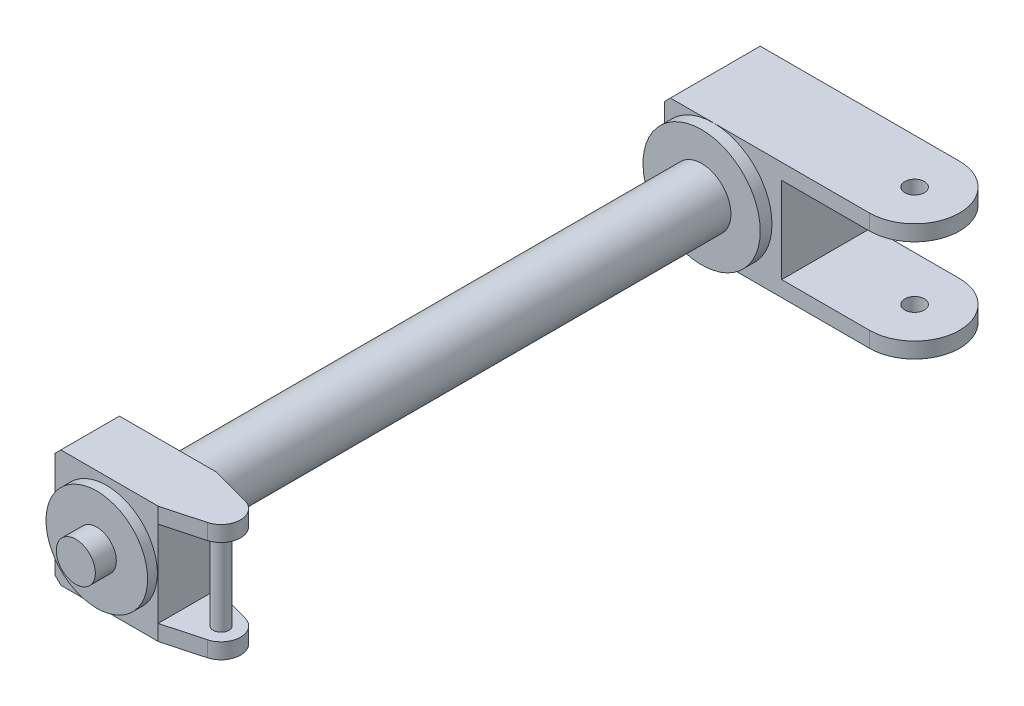
ISO-10303-21;
HEADER;
FILE_DESCRIPTION(('STEP AP214'),'2;1');
FILE_NAME('part.step','',(''),(''),'','','');
FILE_SCHEMA(('AUTOMOTIVE_DESIGN { 1 0 10303 214 1 1 1 1 }'));
ENDSEC;
DATA;
#1=APPLICATION_CONTEXT('core data for automotive mechanical design processes');
#2=APPLICATION_PROTOCOL_DEFINITION('international standard','automotive_design',2000,#1);
#3=PRODUCT_CONTEXT('',#1,'mechanical');
#4=PRODUCT('Part','Part','',(#3));
#5=PRODUCT_RELATED_PRODUCT_CATEGORY('part','',(#4));
#6=PRODUCT_DEFINITION_FORMATION('','',#4);
#7=PRODUCT_DEFINITION_CONTEXT('part definition',#1,'design');
#8=PRODUCT_DEFINITION('design','',#6,#7);
#9=PRODUCT_DEFINITION_SHAPE('','',#8);
#10=(LENGTH_UNIT() NAMED_UNIT(*) SI_UNIT(.MILLI.,.METRE.));
#11=(NAMED_UNIT(*) PLANE_ANGLE_UNIT() SI_UNIT($,.RADIAN.));
#12=(NAMED_UNIT(*) SI_UNIT($,.STERADIAN.) SOLID_ANGLE_UNIT());
#13=UNCERTAINTY_MEASURE_WITH_UNIT(LENGTH_MEASURE(1.E-05),#10,'distance_accuracy_value','');
#14=(GEOMETRIC_REPRESENTATION_CONTEXT(3) GLOBAL_UNCERTAINTY_ASSIGNED_CONTEXT((#13)) GLOBAL_UNIT_ASSIGNED_CONTEXT((#10,
#11,#12)) REPRESENTATION_CONTEXT('',''));
#15=CARTESIAN_POINT('',(0.,0.,0.));
#16=DIRECTION('',(0.,0.,1.));
#17=DIRECTION('',(1.,0.,0.));
#18=AXIS2_PLACEMENT_3D('',#15,#16,#17);
#19=CARTESIAN_POINT('',(1.39999999999993,30.,340.));
#20=DIRECTION('',(0.,0.,1.));
#21=DIRECTION('',(1.,0.,0.));
#22=AXIS2_PLACEMENT_3D('',#19,#20,#21);
#23=PLANE('',#22);
#24=CARTESIAN_POINT('',(1.39999999999993,30.,340.));
#25=DIRECTION('',(0.,0.,1.));
#26=DIRECTION('',(1.,0.,0.));
#27=AXIS2_PLACEMENT_3D('',#24,#25,#26);
#28=CIRCLE('',#27,26.0000000000003);
#29=CARTESIAN_POINT('',(27.4000000000002,30.,340.));
#30=VERTEX_POINT('',#29);
#31=EDGE_CURVE('E489',#30,#30,#28,.T.);
#32=ORIENTED_EDGE('',*,*,#31,.T.);
#33=EDGE_LOOP('',(#32));
#34=FACE_BOUND('',#33,.T.);
#35=CARTESIAN_POINT('',(1.39999999999993,30.,340.));
#36=DIRECTION('',(0.,0.,1.));
#37=DIRECTION('',(1.,0.,0.));
#38=AXIS2_PLACEMENT_3D('',#35,#36,#37);
#39=CIRCLE('',#38,10.);
#40=CARTESIAN_POINT('',(11.3999999999999,30.,340.));
#41=VERTEX_POINT('',#40);
#42=EDGE_CURVE('E492',#41,#41,#39,.T.);
#43=ORIENTED_EDGE('',*,*,#42,.F.);
#44=EDGE_LOOP('',(#43));
#45=FACE_BOUND('',#44,.T.);
#46=ADVANCED_FACE('F37',(#34,#45),#23,.T.);
#47=CARTESIAN_POINT('',(0.,0.,335.));
#48=DIRECTION('',(0.,0.,-1.));
#49=DIRECTION('',(-1.,0.,0.));
#50=AXIS2_PLACEMENT_3D('',#47,#48,#49);
#51=PLANE('',#50);
#52=DIRECTION('',(1.,0.,0.));
#53=VECTOR('',#52,1.);
#54=CARTESIAN_POINT('',(55.,0.,335.));
#55=LINE('',#54,#53);
#56=CARTESIAN_POINT('',(-22.,0.,335.));
#57=VERTEX_POINT('',#56);
#58=CARTESIAN_POINT('',(27.7999999999997,0.,335.));
#59=VERTEX_POINT('',#58);
#60=EDGE_CURVE('E242',#57,#59,#55,.T.);
#61=ORIENTED_EDGE('',*,*,#60,.T.);
#62=DIRECTION('',(0.,-1.,0.));
#63=VECTOR('',#62,1.);
#64=CARTESIAN_POINT('',(27.7999999999997,60.,335.));
#65=LINE('',#64,#63);
#66=CARTESIAN_POINT('',(27.7999999999997,8.,335.));
#67=VERTEX_POINT('',#66);
#68=EDGE_CURVE('E432',#67,#59,#65,.T.);
#69=ORIENTED_EDGE('',*,*,#68,.F.);
#70=DIRECTION('',(0.,-1.,0.));
#71=VECTOR('',#70,1.);
#72=CARTESIAN_POINT('',(27.8,52.,335.));
#73=LINE('',#72,#71);
#74=CARTESIAN_POINT('',(27.8,52.,335.));
#75=VERTEX_POINT('',#74);
#76=EDGE_CURVE('E421',#75,#67,#73,.T.);
#77=ORIENTED_EDGE('',*,*,#76,.F.);
#78=CARTESIAN_POINT('',(27.7999999999997,60.,335.));
#79=VERTEX_POINT('',#78);
#80=EDGE_CURVE('E430',#79,#75,#65,.T.);
#81=ORIENTED_EDGE('',*,*,#80,.F.);
#82=DIRECTION('',(-1.,0.,0.));
#83=VECTOR('',#82,1.);
#84=CARTESIAN_POINT('',(-22.,60.,335.));
#85=LINE('',#84,#83);
#86=CARTESIAN_POINT('',(-22.,60.,335.));
#87=VERTEX_POINT('',#86);
#88=EDGE_CURVE('E231',#79,#87,#85,.T.);
#89=ORIENTED_EDGE('',*,*,#88,.T.);
#90=DIRECTION('',(-0.707106781186547,-0.707106781186548,0.));
#91=VECTOR('',#90,1.);
#92=CARTESIAN_POINT('',(-22.,60.,335.));
#93=LINE('',#92,#91);
#94=CARTESIAN_POINT('',(-25.,57.,335.));
#95=VERTEX_POINT('',#94);
#96=EDGE_CURVE('E234',#87,#95,#93,.T.);
#97=ORIENTED_EDGE('',*,*,#96,.T.);
#98=DIRECTION('',(0.,-1.,0.));
#99=VECTOR('',#98,1.);
#100=CARTESIAN_POINT('',(-25.,57.,335.));
#101=LINE('',#100,#99);
#102=CARTESIAN_POINT('',(-25.,3.,335.));
#103=VERTEX_POINT('',#102);
#104=EDGE_CURVE('E441',#95,#103,#101,.T.);
#105=ORIENTED_EDGE('',*,*,#104,.T.);
#106=DIRECTION('',(0.707106781186548,-0.707106781186547,0.));
#107=VECTOR('',#106,1.);
#108=CARTESIAN_POINT('',(-25.,3.,335.));
#109=LINE('',#108,#107);
#110=EDGE_CURVE('E443',#103,#57,#109,.T.);
#111=ORIENTED_EDGE('',*,*,#110,.T.);
#112=EDGE_LOOP('',(#61,#69,#77,#81,#89,#97,#105,#111));
#113=FACE_BOUND('',#112,.T.);
#114=CARTESIAN_POINT('',(1.39999999999993,30.,335.));
#115=DIRECTION('',(0.,0.,-1.));
#116=DIRECTION('',(-1.,0.,0.));
#117=AXIS2_PLACEMENT_3D('',#114,#115,#116);
#118=CIRCLE('',#117,26.0000000000003);
#119=CARTESIAN_POINT('',(-24.6000000000003,30.,335.));
#120=VERTEX_POINT('',#119);
#121=EDGE_CURVE('E11',#120,#120,#118,.F.);
#122=ORIENTED_EDGE('',*,*,#121,.F.);
#123=EDGE_LOOP('',(#122));
#124=FACE_BOUND('',#123,.T.);
#125=ADVANCED_FACE('F360',(#113,#124),#51,.F.);
#126=CARTESIAN_POINT('',(55.,52.,-23.001));
#127=DIRECTION('',(0.,1.,0.));
#128=DIRECTION('',(0.,0.,1.));
#129=AXIS2_PLACEMENT_3D('',#126,#127,#128);
#130=PLANE('',#129);
#131=DIRECTION('',(0.965454698916814,0.,0.260570958357688));
#132=VECTOR('',#131,1.);
#133=CARTESIAN_POINT('',(-29.3618376879306,52.,289.572331726655));
#134=LINE('',#133,#132);
#135=CARTESIAN_POINT('',(27.8,52.,305.));
#136=VERTEX_POINT('',#135);
#137=CARTESIAN_POINT('',(47.6057095835769,52.,310.345453010832));
#138=VERTEX_POINT('',#137);
#139=EDGE_CURVE('E472',#136,#138,#134,.T.);
#140=ORIENTED_EDGE('',*,*,#139,.T.);
#141=CARTESIAN_POINT('',(45.,52.,320.));
#142=DIRECTION('',(0.,1.,0.));
#143=DIRECTION('',(0.,0.,1.));
#144=AXIS2_PLACEMENT_3D('',#141,#142,#143);
#145=CIRCLE('',#144,9.99999999999998);
#146=CARTESIAN_POINT('',(47.6057095835769,52.,329.654546989168));
#147=VERTEX_POINT('',#146);
#148=EDGE_CURVE('E434',#147,#138,#145,.T.);
#149=ORIENTED_EDGE('',*,*,#148,.F.);
#150=DIRECTION('',(-0.965454698916814,0.,0.260570958357688));
#151=VECTOR('',#150,1.);
#152=CARTESIAN_POINT('',(143.215312368295,52.,303.850036582038));
#153=LINE('',#152,#151);
#154=EDGE_CURVE('E484',#147,#75,#153,.T.);
#155=ORIENTED_EDGE('',*,*,#154,.T.);
#156=DIRECTION('',(0.,0.,1.));
#157=VECTOR('',#156,1.);
#158=CARTESIAN_POINT('',(27.8,52.,-23.001));
#159=LINE('',#158,#157);
#160=EDGE_CURVE('E418',#136,#75,#159,.T.);
#161=ORIENTED_EDGE('',*,*,#160,.F.);
#162=EDGE_LOOP('',(#140,#149,#155,#161));
#163=FACE_BOUND('',#162,.T.);
#164=CARTESIAN_POINT('',(45.,52.0000000000209,320.));
#165=DIRECTION('',(0.,1.,0.));
#166=DIRECTION('',(0.,0.,1.));
#167=AXIS2_PLACEMENT_3D('',#164,#165,#166);
#168=CIRCLE('',#167,4.00000000000001);
#169=CARTESIAN_POINT('',(45.,52.0000000000209,324.));
#170=VERTEX_POINT('',#169);
#171=EDGE_CURVE('E46',#170,#170,#168,.F.);
#172=ORIENTED_EDGE('',*,*,#171,.F.);
#173=EDGE_LOOP('',(#172));
#174=FACE_BOUND('',#173,.T.);
#175=ADVANCED_FACE('F357',(#163,#174),#130,.F.);
#176=CARTESIAN_POINT('',(55.,8.,-23.001));
#177=DIRECTION('',(0.,-1.,0.));
#178=DIRECTION('',(0.,0.,-1.));
#179=AXIS2_PLACEMENT_3D('',#176,#177,#178);
#180=PLANE('',#179);
#181=CARTESIAN_POINT('',(45.,8.,320.));
#182=DIRECTION('',(0.,-1.,0.));
#183=DIRECTION('',(0.,0.,-1.));
#184=AXIS2_PLACEMENT_3D('',#181,#182,#183);
#185=CIRCLE('',#184,9.99999999999998);
#186=CARTESIAN_POINT('',(47.6057095835769,8.,310.345453010832));
#187=VERTEX_POINT('',#186);
#188=CARTESIAN_POINT('',(47.6057095835769,8.,329.654546989168));
#189=VERTEX_POINT('',#188);
#190=EDGE_CURVE('E346',#187,#189,#185,.T.);
#191=ORIENTED_EDGE('',*,*,#190,.F.);
#192=DIRECTION('',(-0.965454698916814,0.,-0.260570958357688));
#193=VECTOR('',#192,1.);
#194=CARTESIAN_POINT('',(-29.3618376879306,8.,289.572331726655));
#195=LINE('',#194,#193);
#196=CARTESIAN_POINT('',(27.8,8.,305.));
#197=VERTEX_POINT('',#196);
#198=EDGE_CURVE('E211',#187,#197,#195,.T.);
#199=ORIENTED_EDGE('',*,*,#198,.T.);
#200=DIRECTION('',(0.,0.,1.));
#201=VECTOR('',#200,1.);
#202=CARTESIAN_POINT('',(27.8,8.,-23.001));
#203=LINE('',#202,#201);
#204=EDGE_CURVE('E424',#197,#67,#203,.T.);
#205=ORIENTED_EDGE('',*,*,#204,.T.);
#206=DIRECTION('',(0.965454698916814,0.,-0.260570958357688));
#207=VECTOR('',#206,1.);
#208=CARTESIAN_POINT('',(143.215312368295,8.,303.850036582038));
#209=LINE('',#208,#207);
#210=EDGE_CURVE('E343',#67,#189,#209,.T.);
#211=ORIENTED_EDGE('',*,*,#210,.T.);
#212=EDGE_LOOP('',(#191,#199,#205,#211));
#213=FACE_BOUND('',#212,.T.);
#214=CARTESIAN_POINT('',(45.,7.99999999998136,320.));
#215=DIRECTION('',(0.,-1.,0.));
#216=DIRECTION('',(0.,0.,-1.));
#217=AXIS2_PLACEMENT_3D('',#214,#215,#216);
#218=CIRCLE('',#217,4.00000000000001);
#219=CARTESIAN_POINT('',(45.,7.99999999998136,316.));
#220=VERTEX_POINT('',#219);
#221=EDGE_CURVE('E348',#220,#220,#218,.F.);
#222=ORIENTED_EDGE('',*,*,#221,.F.);
#223=EDGE_LOOP('',(#222));
#224=FACE_BOUND('',#223,.T.);
#225=ADVANCED_FACE('F359',(#213,#224),#180,.F.);
#226=CARTESIAN_POINT('',(-22.,60.,335.));
#227=DIRECTION('',(0.,-1.,0.));
#228=DIRECTION('',(0.,0.,-1.));
#229=AXIS2_PLACEMENT_3D('',#226,#227,#228);
#230=PLANE('',#229);
#231=CARTESIAN_POINT('',(45.,60.,320.));
#232=DIRECTION('',(0.,-1.,0.));
#233=DIRECTION('',(0.,0.,-1.));
#234=AXIS2_PLACEMENT_3D('',#231,#232,#233);
#235=CIRCLE('',#234,9.99999999999998);
#236=CARTESIAN_POINT('',(47.6057095835769,60.,310.345453010832));
#237=VERTEX_POINT('',#236);
#238=CARTESIAN_POINT('',(47.6057095835769,60.,329.654546989168));
#239=VERTEX_POINT('',#238);
#240=EDGE_CURVE('E464',#237,#239,#235,.T.);
#241=ORIENTED_EDGE('',*,*,#240,.F.);
#242=DIRECTION('',(-0.965454698916814,0.,-0.260570958357688));
#243=VECTOR('',#242,1.);
#244=CARTESIAN_POINT('',(-74.8411412884082,60.,277.297715695564));
#245=LINE('',#244,#243);
#246=CARTESIAN_POINT('',(27.8,60.,305.));
#247=VERTEX_POINT('',#246);
#248=EDGE_CURVE('E224',#237,#247,#245,.T.);
#249=ORIENTED_EDGE('',*,*,#248,.T.);
#250=DIRECTION('',(-1.,0.,0.));
#251=VECTOR('',#250,1.);
#252=CARTESIAN_POINT('',(-22.,60.,305.));
#253=LINE('',#252,#251);
#254=CARTESIAN_POINT('',(-22.,60.,305.));
#255=VERTEX_POINT('',#254);
#256=EDGE_CURVE('E438',#247,#255,#253,.T.);
#257=ORIENTED_EDGE('',*,*,#256,.T.);
#258=DIRECTION('',(0.,0.,-1.));
#259=VECTOR('',#258,1.);
#260=CARTESIAN_POINT('',(-22.,60.,335.));
#261=LINE('',#260,#259);
#262=EDGE_CURVE('E248',#87,#255,#261,.T.);
#263=ORIENTED_EDGE('',*,*,#262,.F.);
#264=ORIENTED_EDGE('',*,*,#88,.F.);
#265=DIRECTION('',(0.965454698916814,0.,-0.260570958357688));
#266=VECTOR('',#265,1.);
#267=CARTESIAN_POINT('',(86.1633106461119,60.,319.248060727192));
#268=LINE('',#267,#266);
#269=EDGE_CURVE('E476',#79,#239,#268,.T.);
#270=ORIENTED_EDGE('',*,*,#269,.T.);
#271=EDGE_LOOP('',(#241,#249,#257,#263,#264,#270));
#272=FACE_BOUND('',#271,.T.);
#273=ADVANCED_FACE('F367',(#272),#230,.F.);
#274=CARTESIAN_POINT('',(55.,0.,335.));
#275=DIRECTION('',(0.,1.,0.));
#276=DIRECTION('',(0.,0.,1.));
#277=AXIS2_PLACEMENT_3D('',#274,#275,#276);
#278=PLANE('',#277);
#279=DIRECTION('',(-0.965454698916814,0.,-0.260570958357688));
#280=VECTOR('',#279,1.);
#281=CARTESIAN_POINT('',(-74.8411412884082,0.,277.297715695564));
#282=LINE('',#281,#280);
#283=CARTESIAN_POINT('',(47.6057095835769,0.,310.345453010832));
#284=VERTEX_POINT('',#283);
#285=CARTESIAN_POINT('',(27.8,0.,305.));
#286=VERTEX_POINT('',#285);
#287=EDGE_CURVE('E200',#284,#286,#282,.T.);
#288=ORIENTED_EDGE('',*,*,#287,.F.);
#289=CARTESIAN_POINT('',(45.,0.,320.));
#290=DIRECTION('',(0.,-1.,0.));
#291=DIRECTION('',(0.,0.,-1.));
#292=AXIS2_PLACEMENT_3D('',#289,#290,#291);
#293=CIRCLE('',#292,9.99999999999998);
#294=CARTESIAN_POINT('',(47.6057095835769,0.,329.654546989168));
#295=VERTEX_POINT('',#294);
#296=EDGE_CURVE('E474',#284,#295,#293,.T.);
#297=ORIENTED_EDGE('',*,*,#296,.T.);
#298=DIRECTION('',(0.965454698916814,0.,-0.260570958357688));
#299=VECTOR('',#298,1.);
#300=CARTESIAN_POINT('',(86.1633106461119,0.,319.248060727192));
#301=LINE('',#300,#299);
#302=EDGE_CURVE('E477',#59,#295,#301,.T.);
#303=ORIENTED_EDGE('',*,*,#302,.F.);
#304=ORIENTED_EDGE('',*,*,#60,.F.);
#305=DIRECTION('',(0.,0.,-1.));
#306=VECTOR('',#305,1.);
#307=CARTESIAN_POINT('',(-22.,0.,335.));
#308=LINE('',#307,#306);
#309=CARTESIAN_POINT('',(-22.,0.,305.));
#310=VERTEX_POINT('',#309);
#311=EDGE_CURVE('E230',#57,#310,#308,.T.);
#312=ORIENTED_EDGE('',*,*,#311,.T.);
#313=DIRECTION('',(1.,0.,0.));
#314=VECTOR('',#313,1.);
#315=CARTESIAN_POINT('',(55.,0.,305.));
#316=LINE('',#315,#314);
#317=EDGE_CURVE('E220',#310,#286,#316,.T.);
#318=ORIENTED_EDGE('',*,*,#317,.T.);
#319=EDGE_LOOP('',(#288,#297,#303,#304,#312,#318));
#320=FACE_BOUND('',#319,.T.);
#321=ADVANCED_FACE('F227',(#320),#278,.F.);
#322=CARTESIAN_POINT('',(0.,30.,29.));
#323=DIRECTION('',(0.,0.,1.));
#324=DIRECTION('',(1.,0.,0.));
#325=AXIS2_PLACEMENT_3D('',#322,#323,#324);
#326=PLANE('',#325);
#327=CARTESIAN_POINT('',(0.,30.,29.));
#328=DIRECTION('',(0.,0.,1.));
#329=DIRECTION('',(1.,0.,0.));
#330=AXIS2_PLACEMENT_3D('',#327,#328,#329);
#331=CIRCLE('',#330,30.);
#332=CARTESIAN_POINT('',(30.,30.,29.));
#333=VERTEX_POINT('',#332);
#334=EDGE_CURVE('E258',#333,#333,#331,.T.);
#335=ORIENTED_EDGE('',*,*,#334,.T.);
#336=EDGE_LOOP('',(#335));
#337=FACE_BOUND('',#336,.T.);
#338=CARTESIAN_POINT('',(0.,30.,29.));
#339=DIRECTION('',(0.,0.,1.));
#340=DIRECTION('',(1.,0.,0.));
#341=AXIS2_PLACEMENT_3D('',#338,#339,#340);
#342=CIRCLE('',#341,15.);
#343=CARTESIAN_POINT('',(15.,30.,29.));
#344=VERTEX_POINT('',#343);
#345=EDGE_CURVE('E251',#344,#344,#342,.T.);
#346=ORIENTED_EDGE('',*,*,#345,.F.);
#347=EDGE_LOOP('',(#346));
#348=FACE_BOUND('',#347,.T.);
#349=ADVANCED_FACE('F597',(#337,#348),#326,.T.);
#350=CARTESIAN_POINT('',(-25.,60.,23.));
#351=DIRECTION('',(0.,0.,-1.));
#352=DIRECTION('',(-1.,0.,0.));
#353=AXIS2_PLACEMENT_3D('',#350,#351,#352);
#354=PLANE('',#353);
#355=CARTESIAN_POINT('',(0.,30.,23.));
#356=DIRECTION('',(0.,0.,1.));
#357=DIRECTION('',(1.,0.,0.));
#358=AXIS2_PLACEMENT_3D('',#355,#356,#357);
#359=CIRCLE('',#358,30.);
#360=CARTESIAN_POINT('',(-25.,13.416876048223,23.));
#361=VERTEX_POINT('',#360);
#362=CARTESIAN_POINT('',(0.,0.,23.));
#363=VERTEX_POINT('',#362);
#364=EDGE_CURVE('E581',#361,#363,#359,.T.);
#365=ORIENTED_EDGE('',*,*,#364,.F.);
#366=DIRECTION('',(0.,-1.,0.));
#367=VECTOR('',#366,1.);
#368=CARTESIAN_POINT('',(-25.,60.,23.));
#369=LINE('',#368,#367);
#370=CARTESIAN_POINT('',(-25.,3.,23.));
#371=VERTEX_POINT('',#370);
#372=EDGE_CURVE('E299',#361,#371,#369,.T.);
#373=ORIENTED_EDGE('',*,*,#372,.T.);
#374=DIRECTION('',(-0.707106781186548,0.707106781186547,0.));
#375=VECTOR('',#374,1.);
#376=CARTESIAN_POINT('',(-25.,3.,23.));
#377=LINE('',#376,#375);
#378=CARTESIAN_POINT('',(-22.,0.,23.));
#379=VERTEX_POINT('',#378);
#380=EDGE_CURVE('E328',#371,#379,#377,.F.);
#381=ORIENTED_EDGE('',*,*,#380,.T.);
#382=DIRECTION('',(1.,0.,0.));
#383=VECTOR('',#382,1.);
#384=CARTESIAN_POINT('',(-25.,0.,23.));
#385=LINE('',#384,#383);
#386=EDGE_CURVE('E300',#379,#363,#385,.T.);
#387=ORIENTED_EDGE('',*,*,#386,.T.);
#388=EDGE_LOOP('',(#365,#373,#381,#387));
#389=FACE_BOUND('',#388,.T.);
#390=ADVANCED_FACE('F615',(#389),#354,.F.);
#391=CARTESIAN_POINT('',(0.,60.,23.));
#392=VERTEX_POINT('',#391);
#393=EDGE_CURVE('E255',#363,#392,#359,.T.);
#394=ORIENTED_EDGE('',*,*,#393,.F.);
#395=CARTESIAN_POINT('',(80.,0.,23.));
#396=VERTEX_POINT('',#395);
#397=EDGE_CURVE('E289',#363,#396,#385,.T.);
#398=ORIENTED_EDGE('',*,*,#397,.T.);
#399=DIRECTION('',(0.,-1.,0.));
#400=VECTOR('',#399,1.);
#401=CARTESIAN_POINT('',(80.,60.,23.));
#402=LINE('',#401,#400);
#403=CARTESIAN_POINT('',(80.,8.,23.));
#404=VERTEX_POINT('',#403);
#405=EDGE_CURVE('E318',#404,#396,#402,.T.);
#406=ORIENTED_EDGE('',*,*,#405,.F.);
#407=DIRECTION('',(1.,0.,0.));
#408=VECTOR('',#407,1.);
#409=CARTESIAN_POINT('',(35.,8.,23.));
#410=LINE('',#409,#408);
#411=CARTESIAN_POINT('',(35.,8.,23.));
#412=VERTEX_POINT('',#411);
#413=EDGE_CURVE('E277',#412,#404,#410,.T.);
#414=ORIENTED_EDGE('',*,*,#413,.F.);
#415=DIRECTION('',(0.,-1.,0.));
#416=VECTOR('',#415,1.);
#417=CARTESIAN_POINT('',(35.,52.,23.));
#418=LINE('',#417,#416);
#419=CARTESIAN_POINT('',(35.,52.,23.));
#420=VERTEX_POINT('',#419);
#421=EDGE_CURVE('E266',#420,#412,#418,.T.);
#422=ORIENTED_EDGE('',*,*,#421,.F.);
#423=DIRECTION('',(-1.,0.,0.));
#424=VECTOR('',#423,1.);
#425=CARTESIAN_POINT('',(35.,52.,23.));
#426=LINE('',#425,#424);
#427=CARTESIAN_POINT('',(80.,52.,23.));
#428=VERTEX_POINT('',#427);
#429=EDGE_CURVE('E271',#428,#420,#426,.T.);
#430=ORIENTED_EDGE('',*,*,#429,.F.);
#431=CARTESIAN_POINT('',(80.,60.,23.));
#432=VERTEX_POINT('',#431);
#433=EDGE_CURVE('E319',#432,#428,#402,.T.);
#434=ORIENTED_EDGE('',*,*,#433,.F.);
#435=DIRECTION('',(1.,0.,0.));
#436=VECTOR('',#435,1.);
#437=CARTESIAN_POINT('',(-25.,60.,23.));
#438=LINE('',#437,#436);
#439=EDGE_CURVE('E294',#392,#432,#438,.T.);
#440=ORIENTED_EDGE('',*,*,#439,.F.);
#441=EDGE_LOOP('',(#394,#398,#406,#414,#422,#430,#434,#440));
#442=FACE_BOUND('',#441,.T.);
#443=ADVANCED_FACE('F578',(#442),#354,.F.);
#444=CARTESIAN_POINT('',(-25.,46.583123951777,23.));
#445=VERTEX_POINT('',#444);
#446=EDGE_CURVE('E261',#392,#445,#359,.T.);
#447=ORIENTED_EDGE('',*,*,#446,.F.);
#448=CARTESIAN_POINT('',(-22.,60.,23.));
#449=VERTEX_POINT('',#448);
#450=EDGE_CURVE('E290',#449,#392,#438,.T.);
#451=ORIENTED_EDGE('',*,*,#450,.F.);
#452=DIRECTION('',(-0.707106781186547,-0.707106781186548,0.));
#453=VECTOR('',#452,1.);
#454=CARTESIAN_POINT('',(-22.,60.,23.));
#455=LINE('',#454,#453);
#456=CARTESIAN_POINT('',(-25.,57.,23.));
#457=VERTEX_POINT('',#456);
#458=EDGE_CURVE('E330',#449,#457,#455,.T.);
#459=ORIENTED_EDGE('',*,*,#458,.T.);
#460=EDGE_CURVE('E309',#457,#445,#369,.T.);
#461=ORIENTED_EDGE('',*,*,#460,.T.);
#462=EDGE_LOOP('',(#447,#451,#459,#461));
#463=FACE_BOUND('',#462,.T.);
#464=ADVANCED_FACE('F617',(#463),#354,.F.);
#465=CARTESIAN_POINT('',(80.,60.,0.));
#466=DIRECTION('',(0.,-1.,0.));
#467=DIRECTION('',(0.,0.,-1.));
#468=AXIS2_PLACEMENT_3D('',#465,#466,#467);
#469=CYLINDRICAL_SURFACE('',#468,23.);
#470=ORIENTED_EDGE('',*,*,#433,.T.);
#471=CARTESIAN_POINT('',(80.,52.,0.));
#472=DIRECTION('',(0.,1.,0.));
#473=DIRECTION('',(0.,0.,1.));
#474=AXIS2_PLACEMENT_3D('',#471,#472,#473);
#475=CIRCLE('',#474,23.);
#476=CARTESIAN_POINT('',(80.,52.,-23.));
#477=VERTEX_POINT('',#476);
#478=EDGE_CURVE('E287',#428,#477,#475,.T.);
#479=ORIENTED_EDGE('',*,*,#478,.T.);
#480=DIRECTION('',(0.,-1.,0.));
#481=VECTOR('',#480,1.);
#482=CARTESIAN_POINT('',(80.,60.,-23.));
#483=LINE('',#482,#481);
#484=CARTESIAN_POINT('',(80.,60.,-23.));
#485=VERTEX_POINT('',#484);
#486=EDGE_CURVE('E315',#485,#477,#483,.T.);
#487=ORIENTED_EDGE('',*,*,#486,.F.);
#488=CARTESIAN_POINT('',(80.,60.,0.));
#489=DIRECTION('',(0.,1.,0.));
#490=DIRECTION('',(0.,0.,1.));
#491=AXIS2_PLACEMENT_3D('',#488,#489,#490);
#492=CIRCLE('',#491,23.);
#493=EDGE_CURVE('E293',#432,#485,#492,.T.);
#494=ORIENTED_EDGE('',*,*,#493,.F.);
#495=EDGE_LOOP('',(#470,#479,#487,#494));
#496=FACE_BOUND('',#495,.T.);
#497=ADVANCED_FACE('F562',(#496),#469,.T.);
#498=CARTESIAN_POINT('',(80.,8.,-23.));
#499=VERTEX_POINT('',#498);
#500=CARTESIAN_POINT('',(80.,0.,-23.));
#501=VERTEX_POINT('',#500);
#502=EDGE_CURVE('E314',#499,#501,#483,.T.);
#503=ORIENTED_EDGE('',*,*,#502,.F.);
#504=CARTESIAN_POINT('',(80.,8.,0.));
#505=DIRECTION('',(0.,-1.,0.));
#506=DIRECTION('',(0.,0.,-1.));
#507=AXIS2_PLACEMENT_3D('',#504,#505,#506);
#508=CIRCLE('',#507,23.);
#509=EDGE_CURVE('E284',#499,#404,#508,.T.);
#510=ORIENTED_EDGE('',*,*,#509,.T.);
#511=ORIENTED_EDGE('',*,*,#405,.T.);
#512=CARTESIAN_POINT('',(80.,0.,0.));
#513=DIRECTION('',(0.,1.,0.));
#514=DIRECTION('',(0.,0.,1.));
#515=AXIS2_PLACEMENT_3D('',#512,#513,#514);
#516=CIRCLE('',#515,23.);
#517=EDGE_CURVE('E303',#396,#501,#516,.T.);
#518=ORIENTED_EDGE('',*,*,#517,.T.);
#519=EDGE_LOOP('',(#503,#510,#511,#518));
#520=FACE_BOUND('',#519,.T.);
#521=ADVANCED_FACE('F574',(#520),#469,.T.);
#522=CARTESIAN_POINT('',(-25.,60.,-23.));
#523=DIRECTION('',(0.,0.,1.));
#524=DIRECTION('',(1.,0.,0.));
#525=AXIS2_PLACEMENT_3D('',#522,#523,#524);
#526=PLANE('',#525);
#527=DIRECTION('',(0.,-1.,0.));
#528=VECTOR('',#527,1.);
#529=CARTESIAN_POINT('',(-25.,60.,-23.));
#530=LINE('',#529,#528);
#531=CARTESIAN_POINT('',(-25.,57.,-23.));
#532=VERTEX_POINT('',#531);
#533=CARTESIAN_POINT('',(-25.,3.,-23.));
#534=VERTEX_POINT('',#533);
#535=EDGE_CURVE('E311',#532,#534,#530,.T.);
#536=ORIENTED_EDGE('',*,*,#535,.F.);
#537=DIRECTION('',(0.707106781186547,0.707106781186548,0.));
#538=VECTOR('',#537,1.);
#539=CARTESIAN_POINT('',(-22.,60.,-23.));
#540=LINE('',#539,#538);
#541=CARTESIAN_POINT('',(-22.,60.,-23.));
#542=VERTEX_POINT('',#541);
#543=EDGE_CURVE('E339',#532,#542,#540,.T.);
#544=ORIENTED_EDGE('',*,*,#543,.T.);
#545=DIRECTION('',(-1.,0.,0.));
#546=VECTOR('',#545,1.);
#547=CARTESIAN_POINT('',(-25.,60.,-23.));
#548=LINE('',#547,#546);
#549=EDGE_CURVE('E296',#485,#542,#548,.T.);
#550=ORIENTED_EDGE('',*,*,#549,.F.);
#551=ORIENTED_EDGE('',*,*,#486,.T.);
#552=DIRECTION('',(-1.,0.,0.));
#553=VECTOR('',#552,1.);
#554=CARTESIAN_POINT('',(-25.,52.,-23.));
#555=LINE('',#554,#553);
#556=CARTESIAN_POINT('',(35.,52.,-23.));
#557=VERTEX_POINT('',#556);
#558=EDGE_CURVE('E322',#477,#557,#555,.T.);
#559=ORIENTED_EDGE('',*,*,#558,.T.);
#560=DIRECTION('',(0.,-1.,0.));
#561=VECTOR('',#560,1.);
#562=CARTESIAN_POINT('',(35.,52.,-23.));
#563=LINE('',#562,#561);
#564=CARTESIAN_POINT('',(35.,8.,-23.));
#565=VERTEX_POINT('',#564);
#566=EDGE_CURVE('E267',#557,#565,#563,.T.);
#567=ORIENTED_EDGE('',*,*,#566,.T.);
#568=DIRECTION('',(1.,0.,0.));
#569=VECTOR('',#568,1.);
#570=CARTESIAN_POINT('',(35.,8.,-23.));
#571=LINE('',#570,#569);
#572=EDGE_CURVE('E270',#565,#499,#571,.T.);
#573=ORIENTED_EDGE('',*,*,#572,.T.);
#574=ORIENTED_EDGE('',*,*,#502,.T.);
#575=DIRECTION('',(-1.,0.,0.));
#576=VECTOR('',#575,1.);
#577=CARTESIAN_POINT('',(-25.,0.,-23.));
#578=LINE('',#577,#576);
#579=CARTESIAN_POINT('',(-22.,0.,-23.));
#580=VERTEX_POINT('',#579);
#581=EDGE_CURVE('E306',#501,#580,#578,.T.);
#582=ORIENTED_EDGE('',*,*,#581,.T.);
#583=DIRECTION('',(0.707106781186548,-0.707106781186547,0.));
#584=VECTOR('',#583,1.);
#585=CARTESIAN_POINT('',(-25.,3.,-23.));
#586=LINE('',#585,#584);
#587=EDGE_CURVE('E337',#580,#534,#586,.F.);
#588=ORIENTED_EDGE('',*,*,#587,.T.);
#589=EDGE_LOOP('',(#536,#544,#550,#551,#559,#567,#573,#574,#582,#588));
#590=FACE_BOUND('',#589,.T.);
#591=ADVANCED_FACE('F547',(#590),#526,.F.);
#592=CARTESIAN_POINT('',(-25.,60.,23.));
#593=DIRECTION('',(1.,0.,0.));
#594=DIRECTION('',(0.,0.,-1.));
#595=AXIS2_PLACEMENT_3D('',#592,#593,#594);
#596=PLANE('',#595);
#597=ORIENTED_EDGE('',*,*,#460,.F.);
#598=DIRECTION('',(0.,0.,-1.));
#599=VECTOR('',#598,1.);
#600=CARTESIAN_POINT('',(-25.,57.,-23.));
#601=LINE('',#600,#599);
#602=EDGE_CURVE('E335',#457,#532,#601,.T.);
#603=ORIENTED_EDGE('',*,*,#602,.T.);
#604=ORIENTED_EDGE('',*,*,#535,.T.);
#605=DIRECTION('',(0.,0.,1.));
#606=VECTOR('',#605,1.);
#607=CARTESIAN_POINT('',(-25.,3.,23.));
#608=LINE('',#607,#606);
#609=EDGE_CURVE('E332',#534,#371,#608,.T.);
#610=ORIENTED_EDGE('',*,*,#609,.T.);
#611=ORIENTED_EDGE('',*,*,#372,.F.);
#612=DIRECTION('',(0.,-1.,0.));
#613=VECTOR('',#612,1.);
#614=CARTESIAN_POINT('',(-25.,60.,23.));
#615=LINE('',#614,#613);
#616=EDGE_CURVE('E61',#445,#361,#615,.T.);
#617=ORIENTED_EDGE('',*,*,#616,.F.);
#618=EDGE_LOOP('',(#597,#603,#604,#610,#611,#617));
#619=FACE_BOUND('',#618,.T.);
#620=ADVANCED_FACE('F549',(#619),#596,.F.);
#621=CARTESIAN_POINT('',(80.,60.,0.));
#622=DIRECTION('',(0.,1.,0.));
#623=DIRECTION('',(0.,0.,1.));
#624=AXIS2_PLACEMENT_3D('',#621,#622,#623);
#625=PLANE('',#624);
#626=CARTESIAN_POINT('',(80.,60.,0.));
#627=DIRECTION('',(0.,-1.,0.));
#628=DIRECTION('',(0.,0.,-1.));
#629=AXIS2_PLACEMENT_3D('',#626,#627,#628);
#630=CIRCLE('',#629,5.);
#631=CARTESIAN_POINT('',(80.,60.,-5.));
#632=VERTEX_POINT('',#631);
#633=EDGE_CURVE('E503',#632,#632,#630,.T.);
#634=ORIENTED_EDGE('',*,*,#633,.T.);
#635=EDGE_LOOP('',(#634));
#636=FACE_BOUND('',#635,.T.);
#637=ORIENTED_EDGE('',*,*,#549,.T.);
#638=DIRECTION('',(0.,0.,1.));
#639=VECTOR('',#638,1.);
#640=CARTESIAN_POINT('',(-22.,60.,23.));
#641=LINE('',#640,#639);
#642=EDGE_CURVE('E325',#542,#449,#641,.T.);
#643=ORIENTED_EDGE('',*,*,#642,.T.);
#644=ORIENTED_EDGE('',*,*,#450,.T.);
#645=ORIENTED_EDGE('',*,*,#439,.T.);
#646=ORIENTED_EDGE('',*,*,#493,.T.);
#647=EDGE_LOOP('',(#637,#643,#644,#645,#646));
#648=FACE_BOUND('',#647,.T.);
#649=ADVANCED_FACE('F531',(#636,#648),#625,.T.);
#650=CARTESIAN_POINT('',(80.,0.,0.));
#651=DIRECTION('',(0.,1.,0.));
#652=DIRECTION('',(0.,0.,1.));
#653=AXIS2_PLACEMENT_3D('',#650,#651,#652);
#654=PLANE('',#653);
#655=CARTESIAN_POINT('',(80.,0.,0.));
#656=DIRECTION('',(0.,-1.,0.));
#657=DIRECTION('',(0.,0.,-1.));
#658=AXIS2_PLACEMENT_3D('',#655,#656,#657);
#659=CIRCLE('',#658,5.);
#660=CARTESIAN_POINT('',(80.,0.,-5.));
#661=VERTEX_POINT('',#660);
#662=EDGE_CURVE('E500',#661,#661,#659,.T.);
#663=ORIENTED_EDGE('',*,*,#662,.F.);
#664=EDGE_LOOP('',(#663));
#665=FACE_BOUND('',#664,.T.);
#666=ORIENTED_EDGE('',*,*,#386,.F.);
#667=DIRECTION('',(0.,0.,-1.));
#668=VECTOR('',#667,1.);
#669=CARTESIAN_POINT('',(-22.,0.,0.));
#670=LINE('',#669,#668);
#671=EDGE_CURVE('E341',#379,#580,#670,.T.);
#672=ORIENTED_EDGE('',*,*,#671,.T.);
#673=ORIENTED_EDGE('',*,*,#581,.F.);
#674=ORIENTED_EDGE('',*,*,#517,.F.);
#675=ORIENTED_EDGE('',*,*,#397,.F.);
#676=EDGE_LOOP('',(#666,#672,#673,#674,#675));
#677=FACE_BOUND('',#676,.T.);
#678=ADVANCED_FACE('F527',(#665,#677),#654,.F.);
#679=CARTESIAN_POINT('',(35.,52.,-23.));
#680=DIRECTION('',(0.,1.,0.));
#681=DIRECTION('',(0.,0.,1.));
#682=AXIS2_PLACEMENT_3D('',#679,#680,#681);
#683=PLANE('',#682);
#684=CARTESIAN_POINT('',(80.,52.,0.));
#685=DIRECTION('',(0.,1.,0.));
#686=DIRECTION('',(0.,0.,1.));
#687=AXIS2_PLACEMENT_3D('',#684,#685,#686);
#688=CIRCLE('',#687,5.);
#689=CARTESIAN_POINT('',(80.,52.,5.));
#690=VERTEX_POINT('',#689);
#691=EDGE_CURVE('E495',#690,#690,#688,.T.);
#692=ORIENTED_EDGE('',*,*,#691,.T.);
#693=EDGE_LOOP('',(#692));
#694=FACE_BOUND('',#693,.T.);
#695=ORIENTED_EDGE('',*,*,#429,.T.);
#696=DIRECTION('',(0.,0.,1.));
#697=VECTOR('',#696,1.);
#698=CARTESIAN_POINT('',(35.,52.,-23.));
#699=LINE('',#698,#697);
#700=EDGE_CURVE('E281',#557,#420,#699,.T.);
#701=ORIENTED_EDGE('',*,*,#700,.F.);
#702=ORIENTED_EDGE('',*,*,#558,.F.);
#703=ORIENTED_EDGE('',*,*,#478,.F.);
#704=EDGE_LOOP('',(#695,#701,#702,#703));
#705=FACE_BOUND('',#704,.T.);
#706=ADVANCED_FACE('F530',(#694,#705),#683,.F.);
#707=CARTESIAN_POINT('',(35.,8.,-23.));
#708=DIRECTION('',(0.,-1.,0.));
#709=DIRECTION('',(0.,0.,-1.));
#710=AXIS2_PLACEMENT_3D('',#707,#708,#709);
#711=PLANE('',#710);
#712=CARTESIAN_POINT('',(80.,8.,0.));
#713=DIRECTION('',(0.,-1.,0.));
#714=DIRECTION('',(0.,0.,-1.));
#715=AXIS2_PLACEMENT_3D('',#712,#713,#714);
#716=CIRCLE('',#715,5.);
#717=CARTESIAN_POINT('',(80.,8.,-5.));
#718=VERTEX_POINT('',#717);
#719=EDGE_CURVE('E41',#718,#718,#716,.T.);
#720=ORIENTED_EDGE('',*,*,#719,.T.);
#721=EDGE_LOOP('',(#720));
#722=FACE_BOUND('',#721,.T.);
#723=ORIENTED_EDGE('',*,*,#572,.F.);
#724=DIRECTION('',(0.,0.,1.));
#725=VECTOR('',#724,1.);
#726=CARTESIAN_POINT('',(35.,8.,-23.));
#727=LINE('',#726,#725);
#728=EDGE_CURVE('E274',#565,#412,#727,.T.);
#729=ORIENTED_EDGE('',*,*,#728,.T.);
#730=ORIENTED_EDGE('',*,*,#413,.T.);
#731=ORIENTED_EDGE('',*,*,#509,.F.);
#732=EDGE_LOOP('',(#723,#729,#730,#731));
#733=FACE_BOUND('',#732,.T.);
#734=ADVANCED_FACE('F510',(#722,#733),#711,.F.);
#735=CARTESIAN_POINT('',(35.,52.,-23.));
#736=DIRECTION('',(-1.,0.,0.));
#737=DIRECTION('',(0.,0.,1.));
#738=AXIS2_PLACEMENT_3D('',#735,#736,#737);
#739=PLANE('',#738);
#740=ORIENTED_EDGE('',*,*,#421,.T.);
#741=ORIENTED_EDGE('',*,*,#728,.F.);
#742=ORIENTED_EDGE('',*,*,#566,.F.);
#743=ORIENTED_EDGE('',*,*,#700,.T.);
#744=EDGE_LOOP('',(#740,#741,#742,#743));
#745=FACE_BOUND('',#744,.T.);
#746=ADVANCED_FACE('F569',(#745),#739,.F.);
#747=CARTESIAN_POINT('',(-22.,60.,0.));
#748=DIRECTION('',(-0.707106781186548,0.707106781186547,0.));
#749=DIRECTION('',(0.,0.,-1.));
#750=AXIS2_PLACEMENT_3D('',#747,#748,#749);
#751=PLANE('',#750);
#752=ORIENTED_EDGE('',*,*,#543,.F.);
#753=ORIENTED_EDGE('',*,*,#602,.F.);
#754=ORIENTED_EDGE('',*,*,#458,.F.);
#755=ORIENTED_EDGE('',*,*,#642,.F.);
#756=EDGE_LOOP('',(#752,#753,#754,#755));
#757=FACE_BOUND('',#756,.T.);
#758=ADVANCED_FACE('F552',(#757),#751,.T.);
#759=CARTESIAN_POINT('',(-25.,3.,23.));
#760=DIRECTION('',(0.707106781186547,0.707106781186548,0.));
#761=DIRECTION('',(0.,0.,1.));
#762=AXIS2_PLACEMENT_3D('',#759,#760,#761);
#763=PLANE('',#762);
#764=ORIENTED_EDGE('',*,*,#587,.F.);
#765=ORIENTED_EDGE('',*,*,#671,.F.);
#766=ORIENTED_EDGE('',*,*,#380,.F.);
#767=ORIENTED_EDGE('',*,*,#609,.F.);
#768=EDGE_LOOP('',(#764,#765,#766,#767));
#769=FACE_BOUND('',#768,.T.);
#770=ADVANCED_FACE('F39',(#769),#763,.F.);
#771=CARTESIAN_POINT('',(0.,30.,23.));
#772=DIRECTION('',(0.,0.,1.));
#773=DIRECTION('',(1.,0.,0.));
#774=AXIS2_PLACEMENT_3D('',#771,#772,#773);
#775=PLANE('',#774);
#776=EDGE_CURVE('E264',#445,#361,#359,.T.);
#777=ORIENTED_EDGE('',*,*,#776,.F.);
#778=ORIENTED_EDGE('',*,*,#616,.T.);
#779=EDGE_LOOP('',(#777,#778));
#780=FACE_BOUND('',#779,.T.);
#781=ADVANCED_FACE('F586',(#780),#775,.F.);
#782=CARTESIAN_POINT('',(0.,30.,29.));
#783=DIRECTION('',(0.,0.,-1.));
#784=DIRECTION('',(-1.,0.,0.));
#785=AXIS2_PLACEMENT_3D('',#782,#783,#784);
#786=CYLINDRICAL_SURFACE('',#785,30.);
#787=ORIENTED_EDGE('',*,*,#334,.F.);
#788=EDGE_LOOP('',(#787));
#789=FACE_BOUND('',#788,.T.);
#790=ORIENTED_EDGE('',*,*,#446,.T.);
#791=ORIENTED_EDGE('',*,*,#776,.T.);
#792=ORIENTED_EDGE('',*,*,#364,.T.);
#793=ORIENTED_EDGE('',*,*,#393,.T.);
#794=EDGE_LOOP('',(#790,#791,#792,#793));
#795=FACE_BOUND('',#794,.T.);
#796=ADVANCED_FACE('F584',(#789,#795),#786,.T.);
#797=CARTESIAN_POINT('',(0.,30.,305.));
#798=DIRECTION('',(0.,0.,-1.));
#799=DIRECTION('',(-1.,0.,0.));
#800=AXIS2_PLACEMENT_3D('',#797,#798,#799);
#801=CYLINDRICAL_SURFACE('',#800,15.);
#802=CARTESIAN_POINT('',(0.,30.,305.));
#803=DIRECTION('',(0.,0.,1.));
#804=DIRECTION('',(1.,0.,0.));
#805=AXIS2_PLACEMENT_3D('',#802,#803,#804);
#806=CIRCLE('',#805,15.);
#807=CARTESIAN_POINT('',(15.,30.,305.));
#808=VERTEX_POINT('',#807);
#809=EDGE_CURVE('E252',#808,#808,#806,.T.);
#810=ORIENTED_EDGE('',*,*,#809,.F.);
#811=EDGE_LOOP('',(#810));
#812=FACE_BOUND('',#811,.T.);
#813=ORIENTED_EDGE('',*,*,#345,.T.);
#814=EDGE_LOOP('',(#813));
#815=FACE_BOUND('',#814,.T.);
#816=ADVANCED_FACE('F593',(#812,#815),#801,.T.);
#817=CARTESIAN_POINT('',(0.,0.,305.));
#818=DIRECTION('',(0.,0.,-1.));
#819=DIRECTION('',(-1.,0.,0.));
#820=AXIS2_PLACEMENT_3D('',#817,#818,#819);
#821=PLANE('',#820);
#822=DIRECTION('',(0.,-1.,0.));
#823=VECTOR('',#822,1.);
#824=CARTESIAN_POINT('',(27.8,60.,305.));
#825=LINE('',#824,#823);
#826=EDGE_CURVE('E204',#197,#286,#825,.T.);
#827=ORIENTED_EDGE('',*,*,#826,.T.);
#828=ORIENTED_EDGE('',*,*,#317,.F.);
#829=DIRECTION('',(0.707106781186548,-0.707106781186547,0.));
#830=VECTOR('',#829,1.);
#831=CARTESIAN_POINT('',(-25.,3.,305.));
#832=LINE('',#831,#830);
#833=CARTESIAN_POINT('',(-25.,3.,305.));
#834=VERTEX_POINT('',#833);
#835=EDGE_CURVE('E232',#834,#310,#832,.T.);
#836=ORIENTED_EDGE('',*,*,#835,.F.);
#837=DIRECTION('',(0.,-1.,0.));
#838=VECTOR('',#837,1.);
#839=CARTESIAN_POINT('',(-25.,57.,305.));
#840=LINE('',#839,#838);
#841=CARTESIAN_POINT('',(-25.,57.,305.));
#842=VERTEX_POINT('',#841);
#843=EDGE_CURVE('E236',#842,#834,#840,.T.);
#844=ORIENTED_EDGE('',*,*,#843,.F.);
#845=DIRECTION('',(-0.707106781186547,-0.707106781186548,0.));
#846=VECTOR('',#845,1.);
#847=CARTESIAN_POINT('',(-22.,60.,305.));
#848=LINE('',#847,#846);
#849=EDGE_CURVE('E447',#255,#842,#848,.T.);
#850=ORIENTED_EDGE('',*,*,#849,.F.);
#851=ORIENTED_EDGE('',*,*,#256,.F.);
#852=EDGE_CURVE('E212',#247,#136,#825,.T.);
#853=ORIENTED_EDGE('',*,*,#852,.T.);
#854=DIRECTION('',(0.,-1.,0.));
#855=VECTOR('',#854,1.);
#856=CARTESIAN_POINT('',(27.8,52.,305.));
#857=LINE('',#856,#855);
#858=EDGE_CURVE('E223',#136,#197,#857,.T.);
#859=ORIENTED_EDGE('',*,*,#858,.T.);
#860=EDGE_LOOP('',(#827,#828,#836,#844,#850,#851,#853,#859));
#861=FACE_BOUND('',#860,.T.);
#862=ORIENTED_EDGE('',*,*,#809,.T.);
#863=EDGE_LOOP('',(#862));
#864=FACE_BOUND('',#863,.T.);
#865=ADVANCED_FACE('F217',(#861,#864),#821,.T.);
#866=CARTESIAN_POINT('',(-22.,60.,335.));
#867=DIRECTION('',(0.707106781186548,-0.707106781186547,0.));
#868=DIRECTION('',(0.707106781186547,0.707106781186548,0.));
#869=AXIS2_PLACEMENT_3D('',#866,#867,#868);
#870=PLANE('',#869);
#871=ORIENTED_EDGE('',*,*,#849,.T.);
#872=DIRECTION('',(0.,0.,-1.));
#873=VECTOR('',#872,1.);
#874=CARTESIAN_POINT('',(-25.,57.,335.));
#875=LINE('',#874,#873);
#876=EDGE_CURVE('E245',#95,#842,#875,.T.);
#877=ORIENTED_EDGE('',*,*,#876,.F.);
#878=ORIENTED_EDGE('',*,*,#96,.F.);
#879=ORIENTED_EDGE('',*,*,#262,.T.);
#880=EDGE_LOOP('',(#871,#877,#878,#879));
#881=FACE_BOUND('',#880,.T.);
#882=ADVANCED_FACE('F458',(#881),#870,.F.);
#883=CARTESIAN_POINT('',(-25.,57.,335.));
#884=DIRECTION('',(1.,0.,0.));
#885=DIRECTION('',(0.,0.,-1.));
#886=AXIS2_PLACEMENT_3D('',#883,#884,#885);
#887=PLANE('',#886);
#888=ORIENTED_EDGE('',*,*,#843,.T.);
#889=DIRECTION('',(0.,0.,-1.));
#890=VECTOR('',#889,1.);
#891=CARTESIAN_POINT('',(-25.,3.,335.));
#892=LINE('',#891,#890);
#893=EDGE_CURVE('E241',#103,#834,#892,.T.);
#894=ORIENTED_EDGE('',*,*,#893,.F.);
#895=ORIENTED_EDGE('',*,*,#104,.F.);
#896=ORIENTED_EDGE('',*,*,#876,.T.);
#897=EDGE_LOOP('',(#888,#894,#895,#896));
#898=FACE_BOUND('',#897,.T.);
#899=ADVANCED_FACE('F412',(#898),#887,.F.);
#900=CARTESIAN_POINT('',(-25.,3.,335.));
#901=DIRECTION('',(0.707106781186547,0.707106781186548,0.));
#902=DIRECTION('',(-0.707106781186548,0.707106781186547,0.));
#903=AXIS2_PLACEMENT_3D('',#900,#901,#902);
#904=PLANE('',#903);
#905=ORIENTED_EDGE('',*,*,#835,.T.);
#906=ORIENTED_EDGE('',*,*,#311,.F.);
#907=ORIENTED_EDGE('',*,*,#110,.F.);
#908=ORIENTED_EDGE('',*,*,#893,.T.);
#909=EDGE_LOOP('',(#905,#906,#907,#908));
#910=FACE_BOUND('',#909,.T.);
#911=ADVANCED_FACE('F406',(#910),#904,.F.);
#912=CARTESIAN_POINT('',(27.8,52.,-23.001));
#913=DIRECTION('',(-1.,0.,0.));
#914=DIRECTION('',(0.,-1.,0.));
#915=AXIS2_PLACEMENT_3D('',#912,#913,#914);
#916=PLANE('',#915);
#917=ORIENTED_EDGE('',*,*,#160,.T.);
#918=ORIENTED_EDGE('',*,*,#76,.T.);
#919=ORIENTED_EDGE('',*,*,#204,.F.);
#920=ORIENTED_EDGE('',*,*,#858,.F.);
#921=EDGE_LOOP('',(#917,#918,#919,#920));
#922=FACE_BOUND('',#921,.T.);
#923=ADVANCED_FACE('F404',(#922),#916,.F.);
#924=CARTESIAN_POINT('',(86.1633106461119,60.,319.248060727192));
#925=DIRECTION('',(-0.260570958357688,0.,-0.965454698916814));
#926=DIRECTION('',(-0.965454698916814,0.,0.260570958357688));
#927=AXIS2_PLACEMENT_3D('',#924,#925,#926);
#928=PLANE('',#927);
#929=ORIENTED_EDGE('',*,*,#68,.T.);
#930=ORIENTED_EDGE('',*,*,#302,.T.);
#931=DIRECTION('',(0.,-1.,0.));
#932=VECTOR('',#931,1.);
#933=CARTESIAN_POINT('',(47.6057095835769,60.,329.654546989168));
#934=LINE('',#933,#932);
#935=EDGE_CURVE('E53',#189,#295,#934,.T.);
#936=ORIENTED_EDGE('',*,*,#935,.F.);
#937=ORIENTED_EDGE('',*,*,#210,.F.);
#938=EDGE_LOOP('',(#929,#930,#936,#937));
#939=FACE_BOUND('',#938,.T.);
#940=ADVANCED_FACE('F400',(#939),#928,.F.);
#941=CARTESIAN_POINT('',(45.,60.,320.));
#942=DIRECTION('',(0.,-1.,0.));
#943=DIRECTION('',(0.,0.,-1.));
#944=AXIS2_PLACEMENT_3D('',#941,#942,#943);
#945=CYLINDRICAL_SURFACE('',#944,9.99999999999998);
#946=ORIENTED_EDGE('',*,*,#190,.T.);
#947=ORIENTED_EDGE('',*,*,#935,.T.);
#948=ORIENTED_EDGE('',*,*,#296,.F.);
#949=DIRECTION('',(0.,-1.,0.));
#950=VECTOR('',#949,1.);
#951=CARTESIAN_POINT('',(47.6057095835769,60.,310.345453010832));
#952=LINE('',#951,#950);
#953=EDGE_CURVE('E207',#187,#284,#952,.T.);
#954=ORIENTED_EDGE('',*,*,#953,.F.);
#955=EDGE_LOOP('',(#946,#947,#948,#954));
#956=FACE_BOUND('',#955,.T.);
#957=ADVANCED_FACE('F402',(#956),#945,.T.);
#958=ORIENTED_EDGE('',*,*,#148,.T.);
#959=EDGE_CURVE('E467',#237,#138,#952,.T.);
#960=ORIENTED_EDGE('',*,*,#959,.F.);
#961=ORIENTED_EDGE('',*,*,#240,.T.);
#962=EDGE_CURVE('E481',#239,#147,#934,.T.);
#963=ORIENTED_EDGE('',*,*,#962,.T.);
#964=EDGE_LOOP('',(#958,#960,#961,#963));
#965=FACE_BOUND('',#964,.T.);
#966=ADVANCED_FACE('F398',(#965),#945,.T.);
#967=ORIENTED_EDGE('',*,*,#962,.F.);
#968=ORIENTED_EDGE('',*,*,#269,.F.);
#969=ORIENTED_EDGE('',*,*,#80,.T.);
#970=ORIENTED_EDGE('',*,*,#154,.F.);
#971=EDGE_LOOP('',(#967,#968,#969,#970));
#972=FACE_BOUND('',#971,.T.);
#973=ADVANCED_FACE('F394',(#972),#928,.F.);
#974=CARTESIAN_POINT('',(-74.8411412884082,60.,277.297715695564));
#975=DIRECTION('',(-0.260570958357688,0.,0.965454698916814));
#976=DIRECTION('',(0.965454698916814,0.,0.260570958357688));
#977=AXIS2_PLACEMENT_3D('',#974,#975,#976);
#978=PLANE('',#977);
#979=ORIENTED_EDGE('',*,*,#852,.F.);
#980=ORIENTED_EDGE('',*,*,#248,.F.);
#981=ORIENTED_EDGE('',*,*,#959,.T.);
#982=ORIENTED_EDGE('',*,*,#139,.F.);
#983=EDGE_LOOP('',(#979,#980,#981,#982));
#984=FACE_BOUND('',#983,.T.);
#985=ADVANCED_FACE('F391',(#984),#978,.F.);
#986=ORIENTED_EDGE('',*,*,#953,.T.);
#987=ORIENTED_EDGE('',*,*,#287,.T.);
#988=ORIENTED_EDGE('',*,*,#826,.F.);
#989=ORIENTED_EDGE('',*,*,#198,.F.);
#990=EDGE_LOOP('',(#986,#987,#988,#989));
#991=FACE_BOUND('',#990,.T.);
#992=ADVANCED_FACE('F202',(#991),#978,.F.);
#993=CARTESIAN_POINT('',(45.0000000001275,-500000.,320.));
#994=DIRECTION('',(0.,1.,0.));
#995=DIRECTION('',(-1.,0.,0.));
#996=AXIS2_PLACEMENT_3D('',#993,#994,#995);
#997=CYLINDRICAL_SURFACE('',#996,4.00000000000001);
#998=ORIENTED_EDGE('',*,*,#171,.T.);
#999=EDGE_LOOP('',(#998));
#1000=FACE_BOUND('',#999,.T.);
#1001=ORIENTED_EDGE('',*,*,#221,.T.);
#1002=EDGE_LOOP('',(#1001));
#1003=FACE_BOUND('',#1002,.T.);
#1004=ADVANCED_FACE('F354',(#1000,#1003),#997,.T.);
#1005=CARTESIAN_POINT('',(1.39999999999993,30.,340.));
#1006=DIRECTION('',(0.,0.,-1.));
#1007=DIRECTION('',(-1.,0.,0.));
#1008=AXIS2_PLACEMENT_3D('',#1005,#1006,#1007);
#1009=CYLINDRICAL_SURFACE('',#1008,26.0000000000003);
#1010=ORIENTED_EDGE('',*,*,#31,.F.);
#1011=EDGE_LOOP('',(#1010));
#1012=FACE_BOUND('',#1011,.T.);
#1013=ORIENTED_EDGE('',*,*,#121,.T.);
#1014=EDGE_LOOP('',(#1013));
#1015=FACE_BOUND('',#1014,.T.);
#1016=ADVANCED_FACE('F385',(#1012,#1015),#1009,.T.);
#1017=CARTESIAN_POINT('',(1.39999999999993,30.,350.75));
#1018=DIRECTION('',(0.,0.,-1.));
#1019=DIRECTION('',(-1.,0.,0.));
#1020=AXIS2_PLACEMENT_3D('',#1017,#1018,#1019);
#1021=CYLINDRICAL_SURFACE('',#1020,10.);
#1022=CARTESIAN_POINT('',(1.39999999999993,30.,350.75));
#1023=DIRECTION('',(0.,0.,1.));
#1024=DIRECTION('',(1.,0.,0.));
#1025=AXIS2_PLACEMENT_3D('',#1022,#1023,#1024);
#1026=CIRCLE('',#1025,10.);
#1027=CARTESIAN_POINT('',(11.3999999999999,30.,350.75));
#1028=VERTEX_POINT('',#1027);
#1029=EDGE_CURVE('E491',#1028,#1028,#1026,.T.);
#1030=ORIENTED_EDGE('',*,*,#1029,.F.);
#1031=EDGE_LOOP('',(#1030));
#1032=FACE_BOUND('',#1031,.T.);
#1033=ORIENTED_EDGE('',*,*,#42,.T.);
#1034=EDGE_LOOP('',(#1033));
#1035=FACE_BOUND('',#1034,.T.);
#1036=ADVANCED_FACE('F383',(#1032,#1035),#1021,.T.);
#1037=CARTESIAN_POINT('',(1.39999999999993,30.,350.75));
#1038=DIRECTION('',(0.,0.,1.));
#1039=DIRECTION('',(1.,0.,0.));
#1040=AXIS2_PLACEMENT_3D('',#1037,#1038,#1039);
#1041=PLANE('',#1040);
#1042=ORIENTED_EDGE('',*,*,#1029,.T.);
#1043=EDGE_LOOP('',(#1042));
#1044=FACE_BOUND('',#1043,.T.);
#1045=ADVANCED_FACE('F516',(#1044),#1041,.T.);
#1046=CARTESIAN_POINT('',(80.,60.,0.));
#1047=DIRECTION('',(0.,-1.,0.));
#1048=DIRECTION('',(0.,0.,-1.));
#1049=AXIS2_PLACEMENT_3D('',#1046,#1047,#1048);
#1050=CYLINDRICAL_SURFACE('',#1049,5.);
#1051=ORIENTED_EDGE('',*,*,#662,.T.);
#1052=EDGE_LOOP('',(#1051));
#1053=FACE_BOUND('',#1052,.T.);
#1054=ORIENTED_EDGE('',*,*,#719,.F.);
#1055=EDGE_LOOP('',(#1054));
#1056=FACE_BOUND('',#1055,.T.);
#1057=ADVANCED_FACE('F513',(#1053,#1056),#1050,.F.);
#1058=ORIENTED_EDGE('',*,*,#633,.F.);
#1059=EDGE_LOOP('',(#1058));
#1060=FACE_BOUND('',#1059,.T.);
#1061=ORIENTED_EDGE('',*,*,#691,.F.);
#1062=EDGE_LOOP('',(#1061));
#1063=FACE_BOUND('',#1062,.T.);
#1064=ADVANCED_FACE('F515',(#1060,#1063),#1050,.F.);
#1065=CLOSED_SHELL('',(#46,#125,#175,#225,#273,#321,#349,#390,#443,#464,#497,#521,#591,#620,
#649,#678,#706,#734,#746,#758,#770,#781,#796,#816,#865,#882,#899,#911,#923,#940,#957,#966,#973,
#985,#992,#1004,#1016,#1036,#1045,#1057,#1064));
#1066=MANIFOLD_SOLID_BREP('B2',#1065);
#1067=ADVANCED_BREP_SHAPE_REPRESENTATION('',(#18,#1066),#14);
#1068=SHAPE_DEFINITION_REPRESENTATION(#9,#1067);
ENDSEC;
END-ISO-10303-21;
